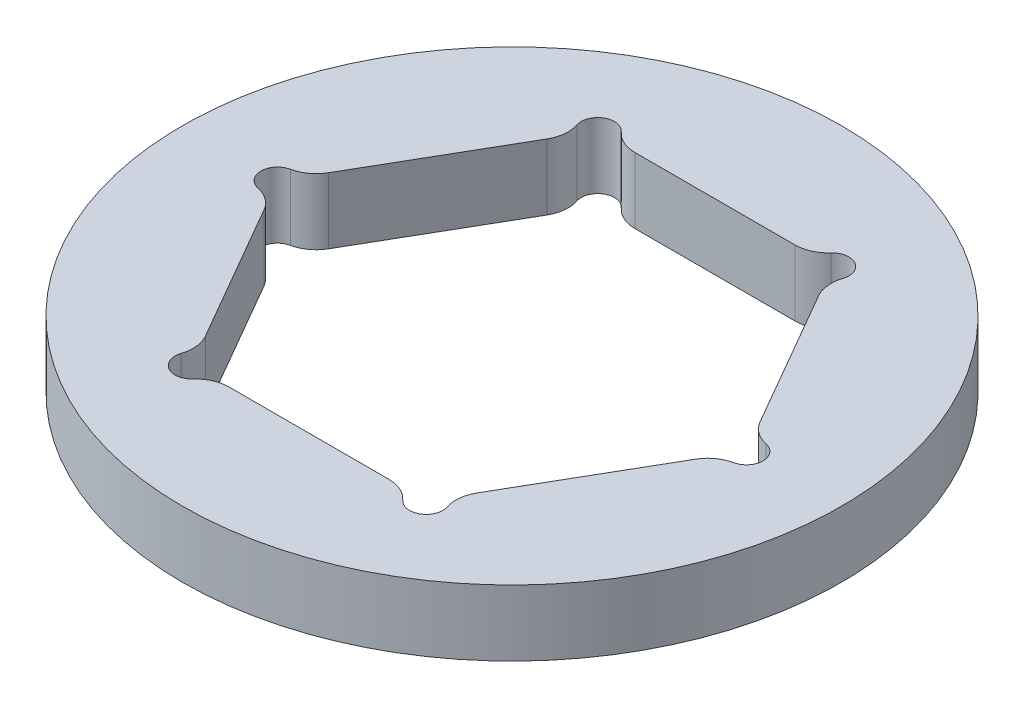
ISO-10303-21;
HEADER;
FILE_DESCRIPTION(('STEP AP214'),'2;1');
FILE_NAME('part.step','',(''),(''),'','','');
FILE_SCHEMA(('AUTOMOTIVE_DESIGN { 1 0 10303 214 1 1 1 1 }'));
ENDSEC;
DATA;
#1=APPLICATION_CONTEXT('core data for automotive mechanical design processes');
#2=APPLICATION_PROTOCOL_DEFINITION('international standard','automotive_design',2000,#1);
#3=PRODUCT_CONTEXT('',#1,'mechanical');
#4=PRODUCT('Part','Part','',(#3));
#5=PRODUCT_RELATED_PRODUCT_CATEGORY('part','',(#4));
#6=PRODUCT_DEFINITION_FORMATION('','',#4);
#7=PRODUCT_DEFINITION_CONTEXT('part definition',#1,'design');
#8=PRODUCT_DEFINITION('design','',#6,#7);
#9=PRODUCT_DEFINITION_SHAPE('','',#8);
#10=(LENGTH_UNIT() NAMED_UNIT(*) SI_UNIT(.MILLI.,.METRE.));
#11=(NAMED_UNIT(*) PLANE_ANGLE_UNIT() SI_UNIT($,.RADIAN.));
#12=(NAMED_UNIT(*) SI_UNIT($,.STERADIAN.) SOLID_ANGLE_UNIT());
#13=UNCERTAINTY_MEASURE_WITH_UNIT(LENGTH_MEASURE(1.E-05),#10,'distance_accuracy_value','');
#14=(GEOMETRIC_REPRESENTATION_CONTEXT(3) GLOBAL_UNCERTAINTY_ASSIGNED_CONTEXT((#13)) GLOBAL_UNIT_ASSIGNED_CONTEXT((#10,
#11,#12)) REPRESENTATION_CONTEXT('',''));
#15=CARTESIAN_POINT('',(0.,0.,0.));
#16=DIRECTION('',(0.,0.,1.));
#17=DIRECTION('',(1.,0.,0.));
#18=AXIS2_PLACEMENT_3D('',#15,#16,#17);
#19=CARTESIAN_POINT('',(0.,0.79375,0.));
#20=DIRECTION('',(0.,1.,0.));
#21=DIRECTION('',(0.,0.,1.));
#22=AXIS2_PLACEMENT_3D('',#19,#20,#21);
#23=PLANE('',#22);
#24=CARTESIAN_POINT('',(0.,0.79375,0.));
#25=DIRECTION('',(0.,1.,0.));
#26=DIRECTION('',(0.,0.,1.));
#27=AXIS2_PLACEMENT_3D('',#24,#25,#26);
#28=CIRCLE('',#27,7.9375);
#29=CARTESIAN_POINT('',(0.,0.79375,7.9375));
#30=VERTEX_POINT('',#29);
#31=EDGE_CURVE('E11',#30,#30,#28,.T.);
#32=ORIENTED_EDGE('',*,*,#31,.T.);
#33=EDGE_LOOP('',(#32));
#34=FACE_BOUND('',#33,.T.);
#35=CARTESIAN_POINT('',(-2.82295414120267,0.79375,-4.8895));
#36=DIRECTION('',(0.,1.,0.));
#37=DIRECTION('',(0.,0.,1.));
#38=AXIS2_PLACEMENT_3D('',#35,#36,#37);
#39=CIRCLE('',#38,0.4);
#40=CARTESIAN_POINT('',(-2.5248117442027,0.79375,-5.15616666666666));
#41=VERTEX_POINT('',#40);
#42=CARTESIAN_POINT('',(-3.20296544737851,0.79375,-4.76463444358617));
#43=VERTEX_POINT('',#42);
#44=EDGE_CURVE('E204',#41,#43,#39,.T.);
#45=ORIENTED_EDGE('',*,*,#44,.F.);
#46=CARTESIAN_POINT('',(-1.92852695020276,0.79375,-5.6895));
#47=DIRECTION('',(0.,-1.,0.));
#48=DIRECTION('',(0.,0.,1.));
#49=AXIS2_PLACEMENT_3D('',#46,#47,#48);
#50=CIRCLE('',#49,0.8);
#51=CARTESIAN_POINT('',(-1.92852695020275,0.79375,-4.88949999999999));
#52=VERTEX_POINT('',#51);
#53=EDGE_CURVE('E196',#52,#41,#50,.T.);
#54=ORIENTED_EDGE('',*,*,#53,.F.);
#55=DIRECTION('',(-1.,0.,0.));
#56=VECTOR('',#55,1.);
#57=CARTESIAN_POINT('',(1.92852695020275,0.79375,-4.8895));
#58=LINE('',#57,#56);
#59=CARTESIAN_POINT('',(1.92852695020275,0.79375,-4.8895));
#60=VERTEX_POINT('',#59);
#61=EDGE_CURVE('E260',#60,#52,#58,.T.);
#62=ORIENTED_EDGE('',*,*,#61,.F.);
#63=CARTESIAN_POINT('',(1.92852695020276,0.79375,-5.6895));
#64=DIRECTION('',(0.,-1.,0.));
#65=DIRECTION('',(0.,0.,1.));
#66=AXIS2_PLACEMENT_3D('',#63,#64,#65);
#67=CIRCLE('',#66,0.8);
#68=CARTESIAN_POINT('',(2.5248117442027,0.79375,-5.15616666666667));
#69=VERTEX_POINT('',#68);
#70=EDGE_CURVE('E258',#69,#60,#67,.T.);
#71=ORIENTED_EDGE('',*,*,#70,.F.);
#72=CARTESIAN_POINT('',(2.82295414120268,0.79375,-4.8895));
#73=DIRECTION('',(0.,1.,0.));
#74=DIRECTION('',(0.,0.,1.));
#75=AXIS2_PLACEMENT_3D('',#72,#73,#74);
#76=CIRCLE('',#75,0.400000000000001);
#77=CARTESIAN_POINT('',(3.20296544737851,0.79375,-4.76463444358617));
#78=VERTEX_POINT('',#77);
#79=EDGE_CURVE('E256',#78,#69,#76,.T.);
#80=ORIENTED_EDGE('',*,*,#79,.F.);
#81=CARTESIAN_POINT('',(3.96298805973018,0.79375,-4.51490333075851));
#82=DIRECTION('',(0.,-1.,0.));
#83=DIRECTION('',(0.,0.,1.));
#84=AXIS2_PLACEMENT_3D('',#81,#82,#83);
#85=CIRCLE('',#84,0.799999999999999);
#86=CARTESIAN_POINT('',(3.27016773670264,0.79375,-4.11490333075851));
#87=VERTEX_POINT('',#86);
#88=EDGE_CURVE('E254',#87,#78,#85,.T.);
#89=ORIENTED_EDGE('',*,*,#88,.F.);
#90=DIRECTION('',(-0.5,0.,-0.866025403784438));
#91=VECTOR('',#90,1.);
#92=CARTESIAN_POINT('',(5.19869468690539,0.79375,-0.774596669241489));
#93=LINE('',#92,#91);
#94=CARTESIAN_POINT('',(5.19869468690539,0.79375,-0.774596669241489));
#95=VERTEX_POINT('',#94);
#96=EDGE_CURVE('E252',#95,#87,#93,.T.);
#97=ORIENTED_EDGE('',*,*,#96,.F.);
#98=CARTESIAN_POINT('',(5.89151500993294,0.79375,-1.17459666924148));
#99=DIRECTION('',(0.,-1.,0.));
#100=DIRECTION('',(0.,0.,1.));
#101=AXIS2_PLACEMENT_3D('',#98,#99,#100);
#102=CIRCLE('',#101,0.8);
#103=CARTESIAN_POINT('',(5.72777719158122,0.79375,-0.391532223080494));
#104=VERTEX_POINT('',#103);
#105=EDGE_CURVE('E250',#104,#95,#102,.T.);
#106=ORIENTED_EDGE('',*,*,#105,.F.);
#107=CARTESIAN_POINT('',(5.64590828240535,0.79375,0.));
#108=DIRECTION('',(0.,1.,0.));
#109=DIRECTION('',(0.,0.,1.));
#110=AXIS2_PLACEMENT_3D('',#107,#108,#109);
#111=CIRCLE('',#110,0.4);
#112=CARTESIAN_POINT('',(5.72777719158122,0.79375,0.391532223080495));
#113=VERTEX_POINT('',#112);
#114=EDGE_CURVE('E248',#113,#104,#111,.T.);
#115=ORIENTED_EDGE('',*,*,#114,.F.);
#116=CARTESIAN_POINT('',(5.89151500993294,0.79375,1.17459666924148));
#117=DIRECTION('',(0.,-1.,0.));
#118=DIRECTION('',(0.,0.,1.));
#119=AXIS2_PLACEMENT_3D('',#116,#117,#118);
#120=CIRCLE('',#119,0.8);
#121=CARTESIAN_POINT('',(5.19869468690539,0.79375,0.774596669241489));
#122=VERTEX_POINT('',#121);
#123=EDGE_CURVE('E246',#122,#113,#120,.T.);
#124=ORIENTED_EDGE('',*,*,#123,.F.);
#125=DIRECTION('',(0.5,0.,-0.866025403784439));
#126=VECTOR('',#125,1.);
#127=CARTESIAN_POINT('',(3.27016773670264,0.79375,4.11490333075851));
#128=LINE('',#127,#126);
#129=CARTESIAN_POINT('',(3.27016773670264,0.79375,4.11490333075851));
#130=VERTEX_POINT('',#129);
#131=EDGE_CURVE('E244',#130,#122,#128,.T.);
#132=ORIENTED_EDGE('',*,*,#131,.F.);
#133=CARTESIAN_POINT('',(3.96298805973019,0.79375,4.51490333075852));
#134=DIRECTION('',(0.,-1.,0.));
#135=DIRECTION('',(0.,0.,1.));
#136=AXIS2_PLACEMENT_3D('',#133,#134,#135);
#137=CIRCLE('',#136,0.8);
#138=CARTESIAN_POINT('',(3.20296544737851,0.79375,4.76463444358617));
#139=VERTEX_POINT('',#138);
#140=EDGE_CURVE('E242',#139,#130,#137,.T.);
#141=ORIENTED_EDGE('',*,*,#140,.F.);
#142=CARTESIAN_POINT('',(2.82295414120268,0.79375,4.8895));
#143=DIRECTION('',(0.,1.,0.));
#144=DIRECTION('',(0.,0.,1.));
#145=AXIS2_PLACEMENT_3D('',#142,#143,#144);
#146=CIRCLE('',#145,0.400000000000001);
#147=CARTESIAN_POINT('',(2.5248117442027,0.79375,5.15616666666667));
#148=VERTEX_POINT('',#147);
#149=EDGE_CURVE('E240',#148,#139,#146,.T.);
#150=ORIENTED_EDGE('',*,*,#149,.F.);
#151=CARTESIAN_POINT('',(1.92852695020275,0.79375,5.6895));
#152=DIRECTION('',(0.,-1.,0.));
#153=DIRECTION('',(0.,0.,1.));
#154=AXIS2_PLACEMENT_3D('',#151,#152,#153);
#155=CIRCLE('',#154,0.800000000000003);
#156=CARTESIAN_POINT('',(1.92852695020275,0.79375,4.8895));
#157=VERTEX_POINT('',#156);
#158=EDGE_CURVE('E238',#157,#148,#155,.T.);
#159=ORIENTED_EDGE('',*,*,#158,.F.);
#160=DIRECTION('',(1.,0.,0.));
#161=VECTOR('',#160,1.);
#162=CARTESIAN_POINT('',(-1.92852695020275,0.79375,4.8895));
#163=LINE('',#162,#161);
#164=CARTESIAN_POINT('',(-1.92852695020275,0.79375,4.8895));
#165=VERTEX_POINT('',#164);
#166=EDGE_CURVE('E236',#165,#157,#163,.T.);
#167=ORIENTED_EDGE('',*,*,#166,.F.);
#168=CARTESIAN_POINT('',(-1.92852695020275,0.79375,5.6895));
#169=DIRECTION('',(0.,-1.,0.));
#170=DIRECTION('',(0.,0.,1.));
#171=AXIS2_PLACEMENT_3D('',#168,#169,#170);
#172=CIRCLE('',#171,0.800000000000001);
#173=CARTESIAN_POINT('',(-2.5248117442027,0.79375,5.15616666666667));
#174=VERTEX_POINT('',#173);
#175=EDGE_CURVE('E234',#174,#165,#172,.T.);
#176=ORIENTED_EDGE('',*,*,#175,.F.);
#177=CARTESIAN_POINT('',(-2.82295414120267,0.79375,4.8895));
#178=DIRECTION('',(0.,1.,0.));
#179=DIRECTION('',(0.,0.,1.));
#180=AXIS2_PLACEMENT_3D('',#177,#178,#179);
#181=CIRCLE('',#180,0.400000000000001);
#182=CARTESIAN_POINT('',(-3.20296544737851,0.79375,4.76463444358617));
#183=VERTEX_POINT('',#182);
#184=EDGE_CURVE('E232',#183,#174,#181,.T.);
#185=ORIENTED_EDGE('',*,*,#184,.F.);
#186=CARTESIAN_POINT('',(-3.96298805973018,0.79375,4.51490333075852));
#187=DIRECTION('',(0.,-1.,0.));
#188=DIRECTION('',(0.,0.,1.));
#189=AXIS2_PLACEMENT_3D('',#186,#187,#188);
#190=CIRCLE('',#189,0.799999999999999);
#191=CARTESIAN_POINT('',(-3.27016773670263,0.79375,4.11490333075851));
#192=VERTEX_POINT('',#191);
#193=EDGE_CURVE('E230',#192,#183,#190,.T.);
#194=ORIENTED_EDGE('',*,*,#193,.F.);
#195=DIRECTION('',(0.500000000000001,0.,0.866025403784438));
#196=VECTOR('',#195,1.);
#197=CARTESIAN_POINT('',(-5.19869468690539,0.79375,0.774596669241496));
#198=LINE('',#197,#196);
#199=CARTESIAN_POINT('',(-5.19869468690539,0.79375,0.774596669241496));
#200=VERTEX_POINT('',#199);
#201=EDGE_CURVE('E228',#200,#192,#198,.T.);
#202=ORIENTED_EDGE('',*,*,#201,.F.);
#203=CARTESIAN_POINT('',(-5.89151500993294,0.79375,1.17459666924149));
#204=DIRECTION('',(0.,-1.,0.));
#205=DIRECTION('',(0.,0.,1.));
#206=AXIS2_PLACEMENT_3D('',#203,#204,#205);
#207=CIRCLE('',#206,0.799999999999999);
#208=CARTESIAN_POINT('',(-5.72777719158121,0.79375,0.391532223080502));
#209=VERTEX_POINT('',#208);
#210=EDGE_CURVE('E226',#209,#200,#207,.T.);
#211=ORIENTED_EDGE('',*,*,#210,.F.);
#212=CARTESIAN_POINT('',(-5.64590828240535,0.79375,0.));
#213=DIRECTION('',(0.,1.,0.));
#214=DIRECTION('',(0.,0.,1.));
#215=AXIS2_PLACEMENT_3D('',#212,#213,#214);
#216=CIRCLE('',#215,0.400000000000001);
#217=CARTESIAN_POINT('',(-5.72777719158121,0.79375,-0.391532223080488));
#218=VERTEX_POINT('',#217);
#219=EDGE_CURVE('E224',#218,#209,#216,.T.);
#220=ORIENTED_EDGE('',*,*,#219,.F.);
#221=CARTESIAN_POINT('',(-5.89151500993294,0.79375,-1.17459666924148));
#222=DIRECTION('',(0.,-1.,0.));
#223=DIRECTION('',(0.,0.,1.));
#224=AXIS2_PLACEMENT_3D('',#221,#222,#223);
#225=CIRCLE('',#224,0.8);
#226=CARTESIAN_POINT('',(-5.19869468690538,0.79375,-0.774596669241482));
#227=VERTEX_POINT('',#226);
#228=EDGE_CURVE('E222',#227,#218,#225,.T.);
#229=ORIENTED_EDGE('',*,*,#228,.F.);
#230=DIRECTION('',(-0.499999999999999,0.,0.866025403784439));
#231=VECTOR('',#230,1.);
#232=CARTESIAN_POINT('',(-3.27016773670263,0.79375,-4.11490333075851));
#233=LINE('',#232,#231);
#234=CARTESIAN_POINT('',(-3.27016773670263,0.79375,-4.11490333075851));
#235=VERTEX_POINT('',#234);
#236=EDGE_CURVE('E218',#235,#227,#233,.T.);
#237=ORIENTED_EDGE('',*,*,#236,.F.);
#238=CARTESIAN_POINT('',(-3.96298805973018,0.79375,-4.51490333075851));
#239=DIRECTION('',(0.,-1.,0.));
#240=DIRECTION('',(0.,0.,1.));
#241=AXIS2_PLACEMENT_3D('',#238,#239,#240);
#242=CIRCLE('',#241,0.8);
#243=EDGE_CURVE('E216',#43,#235,#242,.T.);
#244=ORIENTED_EDGE('',*,*,#243,.F.);
#245=EDGE_LOOP('',(#45,#54,#62,#71,#80,#89,#97,#106,#115,#124,#132,#141,#150,#159,#167,#176,
#185,#194,#202,#211,#220,#229,#237,#244));
#246=FACE_BOUND('',#245,.T.);
#247=ADVANCED_FACE('F35',(#34,#246),#23,.T.);
#248=CARTESIAN_POINT('',(0.,-0.79375,0.));
#249=DIRECTION('',(0.,1.,0.));
#250=DIRECTION('',(0.,0.,1.));
#251=AXIS2_PLACEMENT_3D('',#248,#249,#250);
#252=PLANE('',#251);
#253=CARTESIAN_POINT('',(0.,-0.79375,0.));
#254=DIRECTION('',(0.,1.,0.));
#255=DIRECTION('',(0.,0.,1.));
#256=AXIS2_PLACEMENT_3D('',#253,#254,#255);
#257=CIRCLE('',#256,7.9375);
#258=CARTESIAN_POINT('',(0.,-0.79375,7.9375));
#259=VERTEX_POINT('',#258);
#260=EDGE_CURVE('E39',#259,#259,#257,.T.);
#261=ORIENTED_EDGE('',*,*,#260,.F.);
#262=EDGE_LOOP('',(#261));
#263=FACE_BOUND('',#262,.T.);
#264=CARTESIAN_POINT('',(-1.92852695020276,-0.79375,-5.6895));
#265=DIRECTION('',(0.,-1.,0.));
#266=DIRECTION('',(0.,0.,1.));
#267=AXIS2_PLACEMENT_3D('',#264,#265,#266);
#268=CIRCLE('',#267,0.8);
#269=CARTESIAN_POINT('',(-1.92852695020275,-0.79375,-4.88949999999999));
#270=VERTEX_POINT('',#269);
#271=CARTESIAN_POINT('',(-2.5248117442027,-0.79375,-5.15616666666666));
#272=VERTEX_POINT('',#271);
#273=EDGE_CURVE('E58',#270,#272,#268,.T.);
#274=ORIENTED_EDGE('',*,*,#273,.T.);
#275=CARTESIAN_POINT('',(-2.82295414120267,-0.79375,-4.8895));
#276=DIRECTION('',(0.,1.,0.));
#277=DIRECTION('',(0.,0.,1.));
#278=AXIS2_PLACEMENT_3D('',#275,#276,#277);
#279=CIRCLE('',#278,0.4);
#280=CARTESIAN_POINT('',(-3.20296544737851,-0.79375,-4.76463444358617));
#281=VERTEX_POINT('',#280);
#282=EDGE_CURVE('E211',#272,#281,#279,.T.);
#283=ORIENTED_EDGE('',*,*,#282,.T.);
#284=CARTESIAN_POINT('',(-3.96298805973018,-0.79375,-4.51490333075851));
#285=DIRECTION('',(0.,-1.,0.));
#286=DIRECTION('',(0.,0.,1.));
#287=AXIS2_PLACEMENT_3D('',#284,#285,#286);
#288=CIRCLE('',#287,0.8);
#289=CARTESIAN_POINT('',(-3.27016773670263,-0.79375,-4.11490333075851));
#290=VERTEX_POINT('',#289);
#291=EDGE_CURVE('E264',#281,#290,#288,.T.);
#292=ORIENTED_EDGE('',*,*,#291,.T.);
#293=DIRECTION('',(-0.499999999999999,0.,0.866025403784439));
#294=VECTOR('',#293,1.);
#295=CARTESIAN_POINT('',(-3.27016773670263,-0.79375,-4.11490333075851));
#296=LINE('',#295,#294);
#297=CARTESIAN_POINT('',(-5.19869468690538,-0.79375,-0.774596669241482));
#298=VERTEX_POINT('',#297);
#299=EDGE_CURVE('E267',#290,#298,#296,.T.);
#300=ORIENTED_EDGE('',*,*,#299,.T.);
#301=CARTESIAN_POINT('',(-5.89151500993294,-0.79375,-1.17459666924148));
#302=DIRECTION('',(0.,-1.,0.));
#303=DIRECTION('',(0.,0.,1.));
#304=AXIS2_PLACEMENT_3D('',#301,#302,#303);
#305=CIRCLE('',#304,0.8);
#306=CARTESIAN_POINT('',(-5.72777719158121,-0.79375,-0.391532223080488));
#307=VERTEX_POINT('',#306);
#308=EDGE_CURVE('E270',#298,#307,#305,.T.);
#309=ORIENTED_EDGE('',*,*,#308,.T.);
#310=CARTESIAN_POINT('',(-5.64590828240535,-0.79375,0.));
#311=DIRECTION('',(0.,1.,0.));
#312=DIRECTION('',(0.,0.,1.));
#313=AXIS2_PLACEMENT_3D('',#310,#311,#312);
#314=CIRCLE('',#313,0.400000000000001);
#315=CARTESIAN_POINT('',(-5.72777719158121,-0.79375,0.391532223080502));
#316=VERTEX_POINT('',#315);
#317=EDGE_CURVE('E273',#307,#316,#314,.T.);
#318=ORIENTED_EDGE('',*,*,#317,.T.);
#319=CARTESIAN_POINT('',(-5.89151500993294,-0.79375,1.17459666924149));
#320=DIRECTION('',(0.,-1.,0.));
#321=DIRECTION('',(0.,0.,1.));
#322=AXIS2_PLACEMENT_3D('',#319,#320,#321);
#323=CIRCLE('',#322,0.799999999999999);
#324=CARTESIAN_POINT('',(-5.19869468690539,-0.79375,0.774596669241496));
#325=VERTEX_POINT('',#324);
#326=EDGE_CURVE('E276',#316,#325,#323,.T.);
#327=ORIENTED_EDGE('',*,*,#326,.T.);
#328=DIRECTION('',(0.500000000000001,0.,0.866025403784438));
#329=VECTOR('',#328,1.);
#330=CARTESIAN_POINT('',(-5.19869468690539,-0.79375,0.774596669241496));
#331=LINE('',#330,#329);
#332=CARTESIAN_POINT('',(-3.27016773670263,-0.79375,4.11490333075851));
#333=VERTEX_POINT('',#332);
#334=EDGE_CURVE('E279',#325,#333,#331,.T.);
#335=ORIENTED_EDGE('',*,*,#334,.T.);
#336=CARTESIAN_POINT('',(-3.96298805973018,-0.79375,4.51490333075852));
#337=DIRECTION('',(0.,-1.,0.));
#338=DIRECTION('',(0.,0.,1.));
#339=AXIS2_PLACEMENT_3D('',#336,#337,#338);
#340=CIRCLE('',#339,0.799999999999999);
#341=CARTESIAN_POINT('',(-3.20296544737851,-0.79375,4.76463444358617));
#342=VERTEX_POINT('',#341);
#343=EDGE_CURVE('E282',#333,#342,#340,.T.);
#344=ORIENTED_EDGE('',*,*,#343,.T.);
#345=CARTESIAN_POINT('',(-2.82295414120267,-0.79375,4.8895));
#346=DIRECTION('',(0.,1.,0.));
#347=DIRECTION('',(0.,0.,1.));
#348=AXIS2_PLACEMENT_3D('',#345,#346,#347);
#349=CIRCLE('',#348,0.400000000000001);
#350=CARTESIAN_POINT('',(-2.5248117442027,-0.79375,5.15616666666667));
#351=VERTEX_POINT('',#350);
#352=EDGE_CURVE('E285',#342,#351,#349,.T.);
#353=ORIENTED_EDGE('',*,*,#352,.T.);
#354=CARTESIAN_POINT('',(-1.92852695020275,-0.79375,5.6895));
#355=DIRECTION('',(0.,-1.,0.));
#356=DIRECTION('',(0.,0.,1.));
#357=AXIS2_PLACEMENT_3D('',#354,#355,#356);
#358=CIRCLE('',#357,0.800000000000001);
#359=CARTESIAN_POINT('',(-1.92852695020275,-0.79375,4.8895));
#360=VERTEX_POINT('',#359);
#361=EDGE_CURVE('E288',#351,#360,#358,.T.);
#362=ORIENTED_EDGE('',*,*,#361,.T.);
#363=DIRECTION('',(1.,0.,0.));
#364=VECTOR('',#363,1.);
#365=CARTESIAN_POINT('',(-1.92852695020275,-0.79375,4.8895));
#366=LINE('',#365,#364);
#367=CARTESIAN_POINT('',(1.92852695020275,-0.79375,4.8895));
#368=VERTEX_POINT('',#367);
#369=EDGE_CURVE('E291',#360,#368,#366,.T.);
#370=ORIENTED_EDGE('',*,*,#369,.T.);
#371=CARTESIAN_POINT('',(1.92852695020275,-0.79375,5.6895));
#372=DIRECTION('',(0.,-1.,0.));
#373=DIRECTION('',(0.,0.,1.));
#374=AXIS2_PLACEMENT_3D('',#371,#372,#373);
#375=CIRCLE('',#374,0.800000000000003);
#376=CARTESIAN_POINT('',(2.5248117442027,-0.79375,5.15616666666667));
#377=VERTEX_POINT('',#376);
#378=EDGE_CURVE('E294',#368,#377,#375,.T.);
#379=ORIENTED_EDGE('',*,*,#378,.T.);
#380=CARTESIAN_POINT('',(2.82295414120268,-0.79375,4.8895));
#381=DIRECTION('',(0.,1.,0.));
#382=DIRECTION('',(0.,0.,1.));
#383=AXIS2_PLACEMENT_3D('',#380,#381,#382);
#384=CIRCLE('',#383,0.400000000000001);
#385=CARTESIAN_POINT('',(3.20296544737851,-0.79375,4.76463444358617));
#386=VERTEX_POINT('',#385);
#387=EDGE_CURVE('E297',#377,#386,#384,.T.);
#388=ORIENTED_EDGE('',*,*,#387,.T.);
#389=CARTESIAN_POINT('',(3.96298805973019,-0.79375,4.51490333075852));
#390=DIRECTION('',(0.,-1.,0.));
#391=DIRECTION('',(0.,0.,1.));
#392=AXIS2_PLACEMENT_3D('',#389,#390,#391);
#393=CIRCLE('',#392,0.8);
#394=CARTESIAN_POINT('',(3.27016773670264,-0.79375,4.11490333075851));
#395=VERTEX_POINT('',#394);
#396=EDGE_CURVE('E300',#386,#395,#393,.T.);
#397=ORIENTED_EDGE('',*,*,#396,.T.);
#398=DIRECTION('',(0.5,0.,-0.866025403784439));
#399=VECTOR('',#398,1.);
#400=CARTESIAN_POINT('',(3.27016773670264,-0.79375,4.11490333075851));
#401=LINE('',#400,#399);
#402=CARTESIAN_POINT('',(5.19869468690539,-0.79375,0.774596669241489));
#403=VERTEX_POINT('',#402);
#404=EDGE_CURVE('E303',#395,#403,#401,.T.);
#405=ORIENTED_EDGE('',*,*,#404,.T.);
#406=CARTESIAN_POINT('',(5.89151500993294,-0.79375,1.17459666924148));
#407=DIRECTION('',(0.,-1.,0.));
#408=DIRECTION('',(0.,0.,1.));
#409=AXIS2_PLACEMENT_3D('',#406,#407,#408);
#410=CIRCLE('',#409,0.8);
#411=CARTESIAN_POINT('',(5.72777719158122,-0.79375,0.391532223080495));
#412=VERTEX_POINT('',#411);
#413=EDGE_CURVE('E306',#403,#412,#410,.T.);
#414=ORIENTED_EDGE('',*,*,#413,.T.);
#415=CARTESIAN_POINT('',(5.64590828240535,-0.79375,0.));
#416=DIRECTION('',(0.,1.,0.));
#417=DIRECTION('',(0.,0.,1.));
#418=AXIS2_PLACEMENT_3D('',#415,#416,#417);
#419=CIRCLE('',#418,0.4);
#420=CARTESIAN_POINT('',(5.72777719158122,-0.79375,-0.391532223080494));
#421=VERTEX_POINT('',#420);
#422=EDGE_CURVE('E309',#412,#421,#419,.T.);
#423=ORIENTED_EDGE('',*,*,#422,.T.);
#424=CARTESIAN_POINT('',(5.89151500993294,-0.79375,-1.17459666924148));
#425=DIRECTION('',(0.,-1.,0.));
#426=DIRECTION('',(0.,0.,1.));
#427=AXIS2_PLACEMENT_3D('',#424,#425,#426);
#428=CIRCLE('',#427,0.8);
#429=CARTESIAN_POINT('',(5.19869468690539,-0.79375,-0.774596669241489));
#430=VERTEX_POINT('',#429);
#431=EDGE_CURVE('E312',#421,#430,#428,.T.);
#432=ORIENTED_EDGE('',*,*,#431,.T.);
#433=DIRECTION('',(-0.5,0.,-0.866025403784438));
#434=VECTOR('',#433,1.);
#435=CARTESIAN_POINT('',(5.19869468690539,-0.79375,-0.774596669241489));
#436=LINE('',#435,#434);
#437=CARTESIAN_POINT('',(3.27016773670264,-0.79375,-4.11490333075851));
#438=VERTEX_POINT('',#437);
#439=EDGE_CURVE('E315',#430,#438,#436,.T.);
#440=ORIENTED_EDGE('',*,*,#439,.T.);
#441=CARTESIAN_POINT('',(3.96298805973018,-0.79375,-4.51490333075851));
#442=DIRECTION('',(0.,-1.,0.));
#443=DIRECTION('',(0.,0.,1.));
#444=AXIS2_PLACEMENT_3D('',#441,#442,#443);
#445=CIRCLE('',#444,0.799999999999999);
#446=CARTESIAN_POINT('',(3.20296544737851,-0.79375,-4.76463444358617));
#447=VERTEX_POINT('',#446);
#448=EDGE_CURVE('E318',#438,#447,#445,.T.);
#449=ORIENTED_EDGE('',*,*,#448,.T.);
#450=CARTESIAN_POINT('',(2.82295414120268,-0.79375,-4.8895));
#451=DIRECTION('',(0.,1.,0.));
#452=DIRECTION('',(0.,0.,1.));
#453=AXIS2_PLACEMENT_3D('',#450,#451,#452);
#454=CIRCLE('',#453,0.400000000000001);
#455=CARTESIAN_POINT('',(2.5248117442027,-0.79375,-5.15616666666667));
#456=VERTEX_POINT('',#455);
#457=EDGE_CURVE('E321',#447,#456,#454,.T.);
#458=ORIENTED_EDGE('',*,*,#457,.T.);
#459=CARTESIAN_POINT('',(1.92852695020276,-0.79375,-5.6895));
#460=DIRECTION('',(0.,-1.,0.));
#461=DIRECTION('',(0.,0.,1.));
#462=AXIS2_PLACEMENT_3D('',#459,#460,#461);
#463=CIRCLE('',#462,0.8);
#464=CARTESIAN_POINT('',(1.92852695020275,-0.79375,-4.8895));
#465=VERTEX_POINT('',#464);
#466=EDGE_CURVE('E324',#456,#465,#463,.T.);
#467=ORIENTED_EDGE('',*,*,#466,.T.);
#468=DIRECTION('',(-1.,0.,0.));
#469=VECTOR('',#468,1.);
#470=CARTESIAN_POINT('',(1.92852695020275,-0.79375,-4.8895));
#471=LINE('',#470,#469);
#472=EDGE_CURVE('E205',#465,#270,#471,.T.);
#473=ORIENTED_EDGE('',*,*,#472,.T.);
#474=EDGE_LOOP('',(#274,#283,#292,#300,#309,#318,#327,#335,#344,#353,#362,#370,#379,#388,#397,
#405,#414,#423,#432,#440,#449,#458,#467,#473));
#475=FACE_BOUND('',#474,.T.);
#476=ADVANCED_FACE('F377',(#263,#475),#252,.F.);
#477=CARTESIAN_POINT('',(0.,0.79375,0.));
#478=DIRECTION('',(0.,-1.,0.));
#479=DIRECTION('',(0.,0.,-1.));
#480=AXIS2_PLACEMENT_3D('',#477,#478,#479);
#481=CYLINDRICAL_SURFACE('',#480,7.9375);
#482=ORIENTED_EDGE('',*,*,#31,.F.);
#483=EDGE_LOOP('',(#482));
#484=FACE_BOUND('',#483,.T.);
#485=ORIENTED_EDGE('',*,*,#260,.T.);
#486=EDGE_LOOP('',(#485));
#487=FACE_BOUND('',#486,.T.);
#488=ADVANCED_FACE('F37',(#484,#487),#481,.T.);
#489=CARTESIAN_POINT('',(-1.92852695020276,0.79375,-5.6895));
#490=DIRECTION('',(0.,-1.,0.));
#491=DIRECTION('',(0.,0.,-1.));
#492=AXIS2_PLACEMENT_3D('',#489,#490,#491);
#493=CYLINDRICAL_SURFACE('',#492,0.8);
#494=ORIENTED_EDGE('',*,*,#273,.F.);
#495=DIRECTION('',(0.,-1.,0.));
#496=VECTOR('',#495,1.);
#497=CARTESIAN_POINT('',(-1.92852695020275,0.79375,-4.88949999999999));
#498=LINE('',#497,#496);
#499=EDGE_CURVE('E200',#52,#270,#498,.T.);
#500=ORIENTED_EDGE('',*,*,#499,.F.);
#501=ORIENTED_EDGE('',*,*,#53,.T.);
#502=DIRECTION('',(0.,-1.,0.));
#503=VECTOR('',#502,1.);
#504=CARTESIAN_POINT('',(-2.5248117442027,0.79375,-5.15616666666666));
#505=LINE('',#504,#503);
#506=EDGE_CURVE('E199',#41,#272,#505,.T.);
#507=ORIENTED_EDGE('',*,*,#506,.T.);
#508=EDGE_LOOP('',(#494,#500,#501,#507));
#509=FACE_BOUND('',#508,.T.);
#510=ADVANCED_FACE('F198',(#509),#493,.T.);
#511=CARTESIAN_POINT('',(-2.82295414120267,0.79375,-4.8895));
#512=DIRECTION('',(0.,-1.,0.));
#513=DIRECTION('',(0.,0.,-1.));
#514=AXIS2_PLACEMENT_3D('',#511,#512,#513);
#515=CYLINDRICAL_SURFACE('',#514,0.4);
#516=ORIENTED_EDGE('',*,*,#282,.F.);
#517=ORIENTED_EDGE('',*,*,#506,.F.);
#518=ORIENTED_EDGE('',*,*,#44,.T.);
#519=DIRECTION('',(0.,-1.,0.));
#520=VECTOR('',#519,1.);
#521=CARTESIAN_POINT('',(-3.20296544737851,0.79375,-4.76463444358617));
#522=LINE('',#521,#520);
#523=EDGE_CURVE('E212',#43,#281,#522,.T.);
#524=ORIENTED_EDGE('',*,*,#523,.T.);
#525=EDGE_LOOP('',(#516,#517,#518,#524));
#526=FACE_BOUND('',#525,.T.);
#527=ADVANCED_FACE('F208',(#526),#515,.F.);
#528=CARTESIAN_POINT('',(-3.96298805973018,0.79375,-4.51490333075851));
#529=DIRECTION('',(0.,-1.,0.));
#530=DIRECTION('',(0.,0.,-1.));
#531=AXIS2_PLACEMENT_3D('',#528,#529,#530);
#532=CYLINDRICAL_SURFACE('',#531,0.8);
#533=ORIENTED_EDGE('',*,*,#291,.F.);
#534=ORIENTED_EDGE('',*,*,#523,.F.);
#535=ORIENTED_EDGE('',*,*,#243,.T.);
#536=DIRECTION('',(0.,-1.,0.));
#537=VECTOR('',#536,1.);
#538=CARTESIAN_POINT('',(-3.27016773670263,0.79375,-4.11490333075851));
#539=LINE('',#538,#537);
#540=EDGE_CURVE('E369',#235,#290,#539,.T.);
#541=ORIENTED_EDGE('',*,*,#540,.T.);
#542=EDGE_LOOP('',(#533,#534,#535,#541));
#543=FACE_BOUND('',#542,.T.);
#544=ADVANCED_FACE('F373',(#543),#532,.T.);
#545=CARTESIAN_POINT('',(-3.27016773670263,0.79375,-4.11490333075851));
#546=DIRECTION('',(0.866025403784439,0.,0.499999999999999));
#547=DIRECTION('',(0.499999999999999,0.,-0.866025403784439));
#548=AXIS2_PLACEMENT_3D('',#545,#546,#547);
#549=PLANE('',#548);
#550=ORIENTED_EDGE('',*,*,#299,.F.);
#551=ORIENTED_EDGE('',*,*,#540,.F.);
#552=ORIENTED_EDGE('',*,*,#236,.T.);
#553=DIRECTION('',(0.,-1.,0.));
#554=VECTOR('',#553,1.);
#555=CARTESIAN_POINT('',(-5.19869468690538,0.79375,-0.774596669241482));
#556=LINE('',#555,#554);
#557=EDGE_CURVE('E367',#227,#298,#556,.T.);
#558=ORIENTED_EDGE('',*,*,#557,.T.);
#559=EDGE_LOOP('',(#550,#551,#552,#558));
#560=FACE_BOUND('',#559,.T.);
#561=ADVANCED_FACE('F475',(#560),#549,.T.);
#562=CARTESIAN_POINT('',(-5.89151500993294,0.79375,-1.17459666924148));
#563=DIRECTION('',(0.,-1.,0.));
#564=DIRECTION('',(0.,0.,-1.));
#565=AXIS2_PLACEMENT_3D('',#562,#563,#564);
#566=CYLINDRICAL_SURFACE('',#565,0.8);
#567=ORIENTED_EDGE('',*,*,#308,.F.);
#568=ORIENTED_EDGE('',*,*,#557,.F.);
#569=ORIENTED_EDGE('',*,*,#228,.T.);
#570=DIRECTION('',(0.,-1.,0.));
#571=VECTOR('',#570,1.);
#572=CARTESIAN_POINT('',(-5.72777719158121,0.79375,-0.391532223080488));
#573=LINE('',#572,#571);
#574=EDGE_CURVE('E365',#218,#307,#573,.T.);
#575=ORIENTED_EDGE('',*,*,#574,.T.);
#576=EDGE_LOOP('',(#567,#568,#569,#575));
#577=FACE_BOUND('',#576,.T.);
#578=ADVANCED_FACE('F473',(#577),#566,.T.);
#579=CARTESIAN_POINT('',(-5.64590828240535,0.79375,0.));
#580=DIRECTION('',(0.,-1.,0.));
#581=DIRECTION('',(0.,0.,-1.));
#582=AXIS2_PLACEMENT_3D('',#579,#580,#581);
#583=CYLINDRICAL_SURFACE('',#582,0.400000000000001);
#584=ORIENTED_EDGE('',*,*,#317,.F.);
#585=ORIENTED_EDGE('',*,*,#574,.F.);
#586=ORIENTED_EDGE('',*,*,#219,.T.);
#587=DIRECTION('',(0.,-1.,0.));
#588=VECTOR('',#587,1.);
#589=CARTESIAN_POINT('',(-5.72777719158121,0.79375,0.391532223080502));
#590=LINE('',#589,#588);
#591=EDGE_CURVE('E363',#209,#316,#590,.T.);
#592=ORIENTED_EDGE('',*,*,#591,.T.);
#593=EDGE_LOOP('',(#584,#585,#586,#592));
#594=FACE_BOUND('',#593,.T.);
#595=ADVANCED_FACE('F467',(#594),#583,.F.);
#596=CARTESIAN_POINT('',(-5.89151500993294,0.79375,1.17459666924149));
#597=DIRECTION('',(0.,-1.,0.));
#598=DIRECTION('',(0.,0.,-1.));
#599=AXIS2_PLACEMENT_3D('',#596,#597,#598);
#600=CYLINDRICAL_SURFACE('',#599,0.799999999999999);
#601=ORIENTED_EDGE('',*,*,#326,.F.);
#602=ORIENTED_EDGE('',*,*,#591,.F.);
#603=ORIENTED_EDGE('',*,*,#210,.T.);
#604=DIRECTION('',(0.,-1.,0.));
#605=VECTOR('',#604,1.);
#606=CARTESIAN_POINT('',(-5.19869468690539,0.79375,0.774596669241496));
#607=LINE('',#606,#605);
#608=EDGE_CURVE('E361',#200,#325,#607,.T.);
#609=ORIENTED_EDGE('',*,*,#608,.T.);
#610=EDGE_LOOP('',(#601,#602,#603,#609));
#611=FACE_BOUND('',#610,.T.);
#612=ADVANCED_FACE('F463',(#611),#600,.T.);
#613=CARTESIAN_POINT('',(-5.19869468690539,0.79375,0.774596669241496));
#614=DIRECTION('',(0.866025403784438,0.,-0.500000000000001));
#615=DIRECTION('',(-0.500000000000001,0.,-0.866025403784438));
#616=AXIS2_PLACEMENT_3D('',#613,#614,#615);
#617=PLANE('',#616);
#618=ORIENTED_EDGE('',*,*,#334,.F.);
#619=ORIENTED_EDGE('',*,*,#608,.F.);
#620=ORIENTED_EDGE('',*,*,#201,.T.);
#621=DIRECTION('',(0.,-1.,0.));
#622=VECTOR('',#621,1.);
#623=CARTESIAN_POINT('',(-3.27016773670263,0.79375,4.11490333075851));
#624=LINE('',#623,#622);
#625=EDGE_CURVE('E359',#192,#333,#624,.T.);
#626=ORIENTED_EDGE('',*,*,#625,.T.);
#627=EDGE_LOOP('',(#618,#619,#620,#626));
#628=FACE_BOUND('',#627,.T.);
#629=ADVANCED_FACE('F460',(#628),#617,.T.);
#630=CARTESIAN_POINT('',(-3.96298805973018,0.79375,4.51490333075852));
#631=DIRECTION('',(0.,-1.,0.));
#632=DIRECTION('',(0.,0.,-1.));
#633=AXIS2_PLACEMENT_3D('',#630,#631,#632);
#634=CYLINDRICAL_SURFACE('',#633,0.799999999999999);
#635=ORIENTED_EDGE('',*,*,#343,.F.);
#636=ORIENTED_EDGE('',*,*,#625,.F.);
#637=ORIENTED_EDGE('',*,*,#193,.T.);
#638=DIRECTION('',(0.,-1.,0.));
#639=VECTOR('',#638,1.);
#640=CARTESIAN_POINT('',(-3.20296544737851,0.79375,4.76463444358617));
#641=LINE('',#640,#639);
#642=EDGE_CURVE('E357',#183,#342,#641,.T.);
#643=ORIENTED_EDGE('',*,*,#642,.T.);
#644=EDGE_LOOP('',(#635,#636,#637,#643));
#645=FACE_BOUND('',#644,.T.);
#646=ADVANCED_FACE('F452',(#645),#634,.T.);
#647=CARTESIAN_POINT('',(-2.82295414120267,0.79375,4.8895));
#648=DIRECTION('',(0.,-1.,0.));
#649=DIRECTION('',(0.,0.,-1.));
#650=AXIS2_PLACEMENT_3D('',#647,#648,#649);
#651=CYLINDRICAL_SURFACE('',#650,0.400000000000001);
#652=ORIENTED_EDGE('',*,*,#352,.F.);
#653=ORIENTED_EDGE('',*,*,#642,.F.);
#654=ORIENTED_EDGE('',*,*,#184,.T.);
#655=DIRECTION('',(0.,-1.,0.));
#656=VECTOR('',#655,1.);
#657=CARTESIAN_POINT('',(-2.5248117442027,0.79375,5.15616666666667));
#658=LINE('',#657,#656);
#659=EDGE_CURVE('E355',#174,#351,#658,.T.);
#660=ORIENTED_EDGE('',*,*,#659,.T.);
#661=EDGE_LOOP('',(#652,#653,#654,#660));
#662=FACE_BOUND('',#661,.T.);
#663=ADVANCED_FACE('F448',(#662),#651,.F.);
#664=CARTESIAN_POINT('',(-1.92852695020275,0.79375,5.6895));
#665=DIRECTION('',(0.,-1.,0.));
#666=DIRECTION('',(0.,0.,-1.));
#667=AXIS2_PLACEMENT_3D('',#664,#665,#666);
#668=CYLINDRICAL_SURFACE('',#667,0.800000000000001);
#669=ORIENTED_EDGE('',*,*,#361,.F.);
#670=ORIENTED_EDGE('',*,*,#659,.F.);
#671=ORIENTED_EDGE('',*,*,#175,.T.);
#672=DIRECTION('',(0.,-1.,0.));
#673=VECTOR('',#672,1.);
#674=CARTESIAN_POINT('',(-1.92852695020275,0.79375,4.8895));
#675=LINE('',#674,#673);
#676=EDGE_CURVE('E353',#165,#360,#675,.T.);
#677=ORIENTED_EDGE('',*,*,#676,.T.);
#678=EDGE_LOOP('',(#669,#670,#671,#677));
#679=FACE_BOUND('',#678,.T.);
#680=ADVANCED_FACE('F445',(#679),#668,.T.);
#681=CARTESIAN_POINT('',(-1.92852695020275,0.79375,4.8895));
#682=DIRECTION('',(0.,0.,-1.));
#683=DIRECTION('',(-1.,0.,0.));
#684=AXIS2_PLACEMENT_3D('',#681,#682,#683);
#685=PLANE('',#684);
#686=ORIENTED_EDGE('',*,*,#369,.F.);
#687=ORIENTED_EDGE('',*,*,#676,.F.);
#688=ORIENTED_EDGE('',*,*,#166,.T.);
#689=DIRECTION('',(0.,-1.,0.));
#690=VECTOR('',#689,1.);
#691=CARTESIAN_POINT('',(1.92852695020275,0.79375,4.8895));
#692=LINE('',#691,#690);
#693=EDGE_CURVE('E351',#157,#368,#692,.T.);
#694=ORIENTED_EDGE('',*,*,#693,.T.);
#695=EDGE_LOOP('',(#686,#687,#688,#694));
#696=FACE_BOUND('',#695,.T.);
#697=ADVANCED_FACE('F437',(#696),#685,.T.);
#698=CARTESIAN_POINT('',(1.92852695020275,0.79375,5.6895));
#699=DIRECTION('',(0.,-1.,0.));
#700=DIRECTION('',(0.,0.,-1.));
#701=AXIS2_PLACEMENT_3D('',#698,#699,#700);
#702=CYLINDRICAL_SURFACE('',#701,0.800000000000003);
#703=ORIENTED_EDGE('',*,*,#378,.F.);
#704=ORIENTED_EDGE('',*,*,#693,.F.);
#705=ORIENTED_EDGE('',*,*,#158,.T.);
#706=DIRECTION('',(0.,-1.,0.));
#707=VECTOR('',#706,1.);
#708=CARTESIAN_POINT('',(2.5248117442027,0.79375,5.15616666666667));
#709=LINE('',#708,#707);
#710=EDGE_CURVE('E349',#148,#377,#709,.T.);
#711=ORIENTED_EDGE('',*,*,#710,.T.);
#712=EDGE_LOOP('',(#703,#704,#705,#711));
#713=FACE_BOUND('',#712,.T.);
#714=ADVANCED_FACE('F433',(#713),#702,.T.);
#715=CARTESIAN_POINT('',(2.82295414120268,0.79375,4.8895));
#716=DIRECTION('',(0.,-1.,0.));
#717=DIRECTION('',(0.,0.,-1.));
#718=AXIS2_PLACEMENT_3D('',#715,#716,#717);
#719=CYLINDRICAL_SURFACE('',#718,0.400000000000001);
#720=ORIENTED_EDGE('',*,*,#387,.F.);
#721=ORIENTED_EDGE('',*,*,#710,.F.);
#722=ORIENTED_EDGE('',*,*,#149,.T.);
#723=DIRECTION('',(0.,-1.,0.));
#724=VECTOR('',#723,1.);
#725=CARTESIAN_POINT('',(3.20296544737851,0.79375,4.76463444358617));
#726=LINE('',#725,#724);
#727=EDGE_CURVE('E347',#139,#386,#726,.T.);
#728=ORIENTED_EDGE('',*,*,#727,.T.);
#729=EDGE_LOOP('',(#720,#721,#722,#728));
#730=FACE_BOUND('',#729,.T.);
#731=ADVANCED_FACE('F430',(#730),#719,.F.);
#732=CARTESIAN_POINT('',(3.96298805973019,0.79375,4.51490333075852));
#733=DIRECTION('',(0.,-1.,0.));
#734=DIRECTION('',(0.,0.,-1.));
#735=AXIS2_PLACEMENT_3D('',#732,#733,#734);
#736=CYLINDRICAL_SURFACE('',#735,0.8);
#737=ORIENTED_EDGE('',*,*,#396,.F.);
#738=ORIENTED_EDGE('',*,*,#727,.F.);
#739=ORIENTED_EDGE('',*,*,#140,.T.);
#740=DIRECTION('',(0.,-1.,0.));
#741=VECTOR('',#740,1.);
#742=CARTESIAN_POINT('',(3.27016773670264,0.79375,4.11490333075851));
#743=LINE('',#742,#741);
#744=EDGE_CURVE('E345',#130,#395,#743,.T.);
#745=ORIENTED_EDGE('',*,*,#744,.T.);
#746=EDGE_LOOP('',(#737,#738,#739,#745));
#747=FACE_BOUND('',#746,.T.);
#748=ADVANCED_FACE('F422',(#747),#736,.T.);
#749=CARTESIAN_POINT('',(3.27016773670264,0.79375,4.11490333075851));
#750=DIRECTION('',(-0.866025403784439,0.,-0.5));
#751=DIRECTION('',(-0.5,0.,0.866025403784439));
#752=AXIS2_PLACEMENT_3D('',#749,#750,#751);
#753=PLANE('',#752);
#754=ORIENTED_EDGE('',*,*,#404,.F.);
#755=ORIENTED_EDGE('',*,*,#744,.F.);
#756=ORIENTED_EDGE('',*,*,#131,.T.);
#757=DIRECTION('',(0.,-1.,0.));
#758=VECTOR('',#757,1.);
#759=CARTESIAN_POINT('',(5.19869468690539,0.79375,0.774596669241489));
#760=LINE('',#759,#758);
#761=EDGE_CURVE('E343',#122,#403,#760,.T.);
#762=ORIENTED_EDGE('',*,*,#761,.T.);
#763=EDGE_LOOP('',(#754,#755,#756,#762));
#764=FACE_BOUND('',#763,.T.);
#765=ADVANCED_FACE('F418',(#764),#753,.T.);
#766=CARTESIAN_POINT('',(5.89151500993294,0.79375,1.17459666924148));
#767=DIRECTION('',(0.,-1.,0.));
#768=DIRECTION('',(0.,0.,-1.));
#769=AXIS2_PLACEMENT_3D('',#766,#767,#768);
#770=CYLINDRICAL_SURFACE('',#769,0.8);
#771=ORIENTED_EDGE('',*,*,#413,.F.);
#772=ORIENTED_EDGE('',*,*,#761,.F.);
#773=ORIENTED_EDGE('',*,*,#123,.T.);
#774=DIRECTION('',(0.,-1.,0.));
#775=VECTOR('',#774,1.);
#776=CARTESIAN_POINT('',(5.72777719158122,0.79375,0.391532223080495));
#777=LINE('',#776,#775);
#778=EDGE_CURVE('E341',#113,#412,#777,.T.);
#779=ORIENTED_EDGE('',*,*,#778,.T.);
#780=EDGE_LOOP('',(#771,#772,#773,#779));
#781=FACE_BOUND('',#780,.T.);
#782=ADVANCED_FACE('F415',(#781),#770,.T.);
#783=CARTESIAN_POINT('',(5.64590828240535,0.79375,0.));
#784=DIRECTION('',(0.,-1.,0.));
#785=DIRECTION('',(0.,0.,-1.));
#786=AXIS2_PLACEMENT_3D('',#783,#784,#785);
#787=CYLINDRICAL_SURFACE('',#786,0.4);
#788=ORIENTED_EDGE('',*,*,#422,.F.);
#789=ORIENTED_EDGE('',*,*,#778,.F.);
#790=ORIENTED_EDGE('',*,*,#114,.T.);
#791=DIRECTION('',(0.,-1.,0.));
#792=VECTOR('',#791,1.);
#793=CARTESIAN_POINT('',(5.72777719158122,0.79375,-0.391532223080494));
#794=LINE('',#793,#792);
#795=EDGE_CURVE('E339',#104,#421,#794,.T.);
#796=ORIENTED_EDGE('',*,*,#795,.T.);
#797=EDGE_LOOP('',(#788,#789,#790,#796));
#798=FACE_BOUND('',#797,.T.);
#799=ADVANCED_FACE('F407',(#798),#787,.F.);
#800=CARTESIAN_POINT('',(5.89151500993294,0.79375,-1.17459666924148));
#801=DIRECTION('',(0.,-1.,0.));
#802=DIRECTION('',(0.,0.,-1.));
#803=AXIS2_PLACEMENT_3D('',#800,#801,#802);
#804=CYLINDRICAL_SURFACE('',#803,0.8);
#805=ORIENTED_EDGE('',*,*,#431,.F.);
#806=ORIENTED_EDGE('',*,*,#795,.F.);
#807=ORIENTED_EDGE('',*,*,#105,.T.);
#808=DIRECTION('',(0.,-1.,0.));
#809=VECTOR('',#808,1.);
#810=CARTESIAN_POINT('',(5.19869468690539,0.79375,-0.774596669241489));
#811=LINE('',#810,#809);
#812=EDGE_CURVE('E337',#95,#430,#811,.T.);
#813=ORIENTED_EDGE('',*,*,#812,.T.);
#814=EDGE_LOOP('',(#805,#806,#807,#813));
#815=FACE_BOUND('',#814,.T.);
#816=ADVANCED_FACE('F403',(#815),#804,.T.);
#817=CARTESIAN_POINT('',(5.19869468690539,0.79375,-0.774596669241489));
#818=DIRECTION('',(-0.866025403784438,0.,0.5));
#819=DIRECTION('',(0.5,0.,0.866025403784438));
#820=AXIS2_PLACEMENT_3D('',#817,#818,#819);
#821=PLANE('',#820);
#822=ORIENTED_EDGE('',*,*,#439,.F.);
#823=ORIENTED_EDGE('',*,*,#812,.F.);
#824=ORIENTED_EDGE('',*,*,#96,.T.);
#825=DIRECTION('',(0.,-1.,0.));
#826=VECTOR('',#825,1.);
#827=CARTESIAN_POINT('',(3.27016773670264,0.79375,-4.11490333075851));
#828=LINE('',#827,#826);
#829=EDGE_CURVE('E335',#87,#438,#828,.T.);
#830=ORIENTED_EDGE('',*,*,#829,.T.);
#831=EDGE_LOOP('',(#822,#823,#824,#830));
#832=FACE_BOUND('',#831,.T.);
#833=ADVANCED_FACE('F400',(#832),#821,.T.);
#834=CARTESIAN_POINT('',(3.96298805973018,0.79375,-4.51490333075851));
#835=DIRECTION('',(0.,-1.,0.));
#836=DIRECTION('',(0.,0.,-1.));
#837=AXIS2_PLACEMENT_3D('',#834,#835,#836);
#838=CYLINDRICAL_SURFACE('',#837,0.799999999999999);
#839=ORIENTED_EDGE('',*,*,#448,.F.);
#840=ORIENTED_EDGE('',*,*,#829,.F.);
#841=ORIENTED_EDGE('',*,*,#88,.T.);
#842=DIRECTION('',(0.,-1.,0.));
#843=VECTOR('',#842,1.);
#844=CARTESIAN_POINT('',(3.20296544737851,0.79375,-4.76463444358617));
#845=LINE('',#844,#843);
#846=EDGE_CURVE('E333',#78,#447,#845,.T.);
#847=ORIENTED_EDGE('',*,*,#846,.T.);
#848=EDGE_LOOP('',(#839,#840,#841,#847));
#849=FACE_BOUND('',#848,.T.);
#850=ADVANCED_FACE('F392',(#849),#838,.T.);
#851=CARTESIAN_POINT('',(2.82295414120268,0.79375,-4.8895));
#852=DIRECTION('',(0.,-1.,0.));
#853=DIRECTION('',(0.,0.,-1.));
#854=AXIS2_PLACEMENT_3D('',#851,#852,#853);
#855=CYLINDRICAL_SURFACE('',#854,0.400000000000001);
#856=ORIENTED_EDGE('',*,*,#457,.F.);
#857=ORIENTED_EDGE('',*,*,#846,.F.);
#858=ORIENTED_EDGE('',*,*,#79,.T.);
#859=DIRECTION('',(0.,-1.,0.));
#860=VECTOR('',#859,1.);
#861=CARTESIAN_POINT('',(2.5248117442027,0.79375,-5.15616666666667));
#862=LINE('',#861,#860);
#863=EDGE_CURVE('E331',#69,#456,#862,.T.);
#864=ORIENTED_EDGE('',*,*,#863,.T.);
#865=EDGE_LOOP('',(#856,#857,#858,#864));
#866=FACE_BOUND('',#865,.T.);
#867=ADVANCED_FACE('F388',(#866),#855,.F.);
#868=CARTESIAN_POINT('',(1.92852695020276,0.79375,-5.6895));
#869=DIRECTION('',(0.,-1.,0.));
#870=DIRECTION('',(0.,0.,-1.));
#871=AXIS2_PLACEMENT_3D('',#868,#869,#870);
#872=CYLINDRICAL_SURFACE('',#871,0.8);
#873=ORIENTED_EDGE('',*,*,#466,.F.);
#874=ORIENTED_EDGE('',*,*,#863,.F.);
#875=ORIENTED_EDGE('',*,*,#70,.T.);
#876=DIRECTION('',(0.,-1.,0.));
#877=VECTOR('',#876,1.);
#878=CARTESIAN_POINT('',(1.92852695020275,0.79375,-4.8895));
#879=LINE('',#878,#877);
#880=EDGE_CURVE('E50',#60,#465,#879,.T.);
#881=ORIENTED_EDGE('',*,*,#880,.T.);
#882=EDGE_LOOP('',(#873,#874,#875,#881));
#883=FACE_BOUND('',#882,.T.);
#884=ADVANCED_FACE('F385',(#883),#872,.T.);
#885=CARTESIAN_POINT('',(1.92852695020275,0.79375,-4.8895));
#886=DIRECTION('',(0.,0.,1.));
#887=DIRECTION('',(1.,0.,0.));
#888=AXIS2_PLACEMENT_3D('',#885,#886,#887);
#889=PLANE('',#888);
#890=ORIENTED_EDGE('',*,*,#472,.F.);
#891=ORIENTED_EDGE('',*,*,#880,.F.);
#892=ORIENTED_EDGE('',*,*,#61,.T.);
#893=ORIENTED_EDGE('',*,*,#499,.T.);
#894=EDGE_LOOP('',(#890,#891,#892,#893));
#895=FACE_BOUND('',#894,.T.);
#896=ADVANCED_FACE('F379',(#895),#889,.T.);
#897=CLOSED_SHELL('',(#247,#476,#488,#510,#527,#544,#561,#578,#595,#612,#629,#646,#663,#680,
#697,#714,#731,#748,#765,#782,#799,#816,#833,#850,#867,#884,#896));
#898=MANIFOLD_SOLID_BREP('B2',#897);
#899=ADVANCED_BREP_SHAPE_REPRESENTATION('',(#18,#898),#14);
#900=SHAPE_DEFINITION_REPRESENTATION(#9,#899);
ENDSEC;
END-ISO-10303-21;
